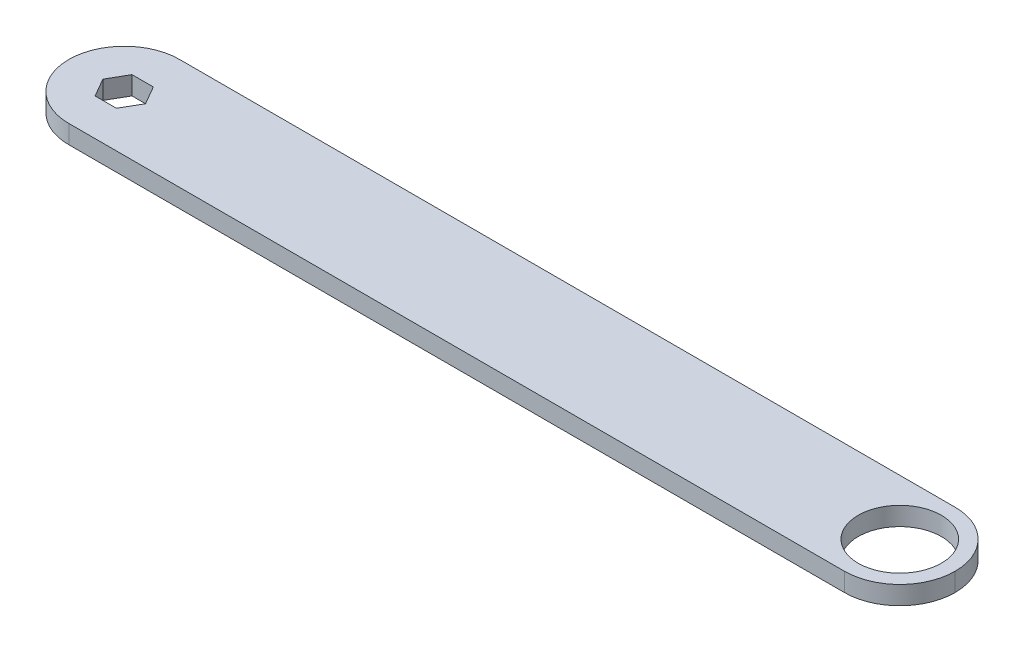
ISO-10303-21;
HEADER;
FILE_DESCRIPTION(('STEP AP214'),'2;1');
FILE_NAME('part.step','',(''),(''),'','','');
FILE_SCHEMA(('AUTOMOTIVE_DESIGN { 1 0 10303 214 1 1 1 1 }'));
ENDSEC;
DATA;
#1=APPLICATION_CONTEXT('core data for automotive mechanical design processes');
#2=APPLICATION_PROTOCOL_DEFINITION('international standard','automotive_design',2000,#1);
#3=PRODUCT_CONTEXT('',#1,'mechanical');
#4=PRODUCT('Part','Part','',(#3));
#5=PRODUCT_RELATED_PRODUCT_CATEGORY('part','',(#4));
#6=PRODUCT_DEFINITION_FORMATION('','',#4);
#7=PRODUCT_DEFINITION_CONTEXT('part definition',#1,'design');
#8=PRODUCT_DEFINITION('design','',#6,#7);
#9=PRODUCT_DEFINITION_SHAPE('','',#8);
#10=(LENGTH_UNIT() NAMED_UNIT(*) SI_UNIT(.MILLI.,.METRE.));
#11=(NAMED_UNIT(*) PLANE_ANGLE_UNIT() SI_UNIT($,.RADIAN.));
#12=(NAMED_UNIT(*) SI_UNIT($,.STERADIAN.) SOLID_ANGLE_UNIT());
#13=UNCERTAINTY_MEASURE_WITH_UNIT(LENGTH_MEASURE(1.E-05),#10,'distance_accuracy_value','');
#14=(GEOMETRIC_REPRESENTATION_CONTEXT(3) GLOBAL_UNCERTAINTY_ASSIGNED_CONTEXT((#13)) GLOBAL_UNIT_ASSIGNED_CONTEXT((#10,
#11,#12)) REPRESENTATION_CONTEXT('',''));
#15=CARTESIAN_POINT('',(0.,0.,0.));
#16=DIRECTION('',(0.,0.,1.));
#17=DIRECTION('',(1.,0.,0.));
#18=AXIS2_PLACEMENT_3D('',#15,#16,#17);
#19=CARTESIAN_POINT('',(-152.4,6.35,-19.05));
#20=DIRECTION('',(0.,0.,1.));
#21=DIRECTION('',(1.,0.,0.));
#22=AXIS2_PLACEMENT_3D('',#19,#20,#21);
#23=PLANE('',#22);
#24=DIRECTION('',(-1.,0.,0.));
#25=VECTOR('',#24,1.);
#26=CARTESIAN_POINT('',(-152.4,6.35,-19.05));
#27=LINE('',#26,#25);
#28=CARTESIAN_POINT('',(133.35,6.35,-19.05));
#29=VERTEX_POINT('',#28);
#30=CARTESIAN_POINT('',(-133.35,6.35,-19.05));
#31=VERTEX_POINT('',#30);
#32=EDGE_CURVE('E195',#29,#31,#27,.T.);
#33=ORIENTED_EDGE('',*,*,#32,.F.);
#34=DIRECTION('',(0.,-1.,0.));
#35=VECTOR('',#34,1.);
#36=CARTESIAN_POINT('',(133.35,6.35,-19.05));
#37=LINE('',#36,#35);
#38=CARTESIAN_POINT('',(133.35,0.,-19.05));
#39=VERTEX_POINT('',#38);
#40=EDGE_CURVE('E11',#29,#39,#37,.T.);
#41=ORIENTED_EDGE('',*,*,#40,.T.);
#42=DIRECTION('',(-1.,0.,0.));
#43=VECTOR('',#42,1.);
#44=CARTESIAN_POINT('',(-152.4,0.,-19.05));
#45=LINE('',#44,#43);
#46=CARTESIAN_POINT('',(-133.35,0.,-19.05));
#47=VERTEX_POINT('',#46);
#48=EDGE_CURVE('E192',#39,#47,#45,.T.);
#49=ORIENTED_EDGE('',*,*,#48,.T.);
#50=DIRECTION('',(0.,-1.,0.));
#51=VECTOR('',#50,1.);
#52=CARTESIAN_POINT('',(-133.35,6.35,-19.05));
#53=LINE('',#52,#51);
#54=EDGE_CURVE('E46',#47,#31,#53,.F.);
#55=ORIENTED_EDGE('',*,*,#54,.T.);
#56=EDGE_LOOP('',(#33,#41,#49,#55));
#57=FACE_BOUND('',#56,.T.);
#58=ADVANCED_FACE('F37',(#57),#23,.F.);
#59=CARTESIAN_POINT('',(-152.4,6.35,19.05));
#60=DIRECTION('',(0.,0.,-1.));
#61=DIRECTION('',(-1.,0.,0.));
#62=AXIS2_PLACEMENT_3D('',#59,#60,#61);
#63=PLANE('',#62);
#64=DIRECTION('',(1.,0.,0.));
#65=VECTOR('',#64,1.);
#66=CARTESIAN_POINT('',(-152.4,0.,19.05));
#67=LINE('',#66,#65);
#68=CARTESIAN_POINT('',(-133.35,0.,19.05));
#69=VERTEX_POINT('',#68);
#70=CARTESIAN_POINT('',(133.35,0.,19.05));
#71=VERTEX_POINT('',#70);
#72=EDGE_CURVE('E198',#69,#71,#67,.T.);
#73=ORIENTED_EDGE('',*,*,#72,.T.);
#74=DIRECTION('',(0.,-1.,0.));
#75=VECTOR('',#74,1.);
#76=CARTESIAN_POINT('',(133.35,6.35,19.05));
#77=LINE('',#76,#75);
#78=CARTESIAN_POINT('',(133.35,6.35,19.05));
#79=VERTEX_POINT('',#78);
#80=EDGE_CURVE('E215',#71,#79,#77,.F.);
#81=ORIENTED_EDGE('',*,*,#80,.T.);
#82=DIRECTION('',(1.,0.,0.));
#83=VECTOR('',#82,1.);
#84=CARTESIAN_POINT('',(-152.4,6.35,19.05));
#85=LINE('',#84,#83);
#86=CARTESIAN_POINT('',(-133.35,6.35,19.05));
#87=VERTEX_POINT('',#86);
#88=EDGE_CURVE('E197',#87,#79,#85,.T.);
#89=ORIENTED_EDGE('',*,*,#88,.F.);
#90=DIRECTION('',(0.,-1.,0.));
#91=VECTOR('',#90,1.);
#92=CARTESIAN_POINT('',(-133.35,6.35,19.05));
#93=LINE('',#92,#91);
#94=EDGE_CURVE('E212',#87,#69,#93,.T.);
#95=ORIENTED_EDGE('',*,*,#94,.T.);
#96=EDGE_LOOP('',(#73,#81,#89,#95));
#97=FACE_BOUND('',#96,.T.);
#98=ADVANCED_FACE('F246',(#97),#63,.F.);
#99=CARTESIAN_POINT('',(0.,6.35,0.));
#100=DIRECTION('',(0.,-1.,0.));
#101=DIRECTION('',(0.,0.,-1.));
#102=AXIS2_PLACEMENT_3D('',#99,#100,#101);
#103=PLANE('',#102);
#104=DIRECTION('',(-1.,0.,0.));
#105=VECTOR('',#104,1.);
#106=CARTESIAN_POINT('',(-129.683825790646,6.35,-6.34999999999999));
#107=LINE('',#106,#105);
#108=CARTESIAN_POINT('',(-129.683825790646,6.35,-6.34999999999999));
#109=VERTEX_POINT('',#108);
#110=CARTESIAN_POINT('',(-137.016174209354,6.35,-6.34999999999999));
#111=VERTEX_POINT('',#110);
#112=EDGE_CURVE('E168',#109,#111,#107,.T.);
#113=ORIENTED_EDGE('',*,*,#112,.F.);
#114=DIRECTION('',(-0.500000000000002,0.,-0.866025403784438));
#115=VECTOR('',#114,1.);
#116=CARTESIAN_POINT('',(-126.017651581292,6.35,0.));
#117=LINE('',#116,#115);
#118=CARTESIAN_POINT('',(-126.017651581292,6.35,0.));
#119=VERTEX_POINT('',#118);
#120=EDGE_CURVE('E135',#119,#109,#117,.T.);
#121=ORIENTED_EDGE('',*,*,#120,.F.);
#122=DIRECTION('',(0.5,0.,-0.866025403784438));
#123=VECTOR('',#122,1.);
#124=CARTESIAN_POINT('',(-129.683825790646,6.35,6.35000000000004));
#125=LINE('',#124,#123);
#126=CARTESIAN_POINT('',(-129.683825790646,6.35,6.35000000000004));
#127=VERTEX_POINT('',#126);
#128=EDGE_CURVE('E154',#127,#119,#125,.T.);
#129=ORIENTED_EDGE('',*,*,#128,.F.);
#130=DIRECTION('',(1.,0.,0.));
#131=VECTOR('',#130,1.);
#132=CARTESIAN_POINT('',(-137.016174209354,6.35,6.35000000000004));
#133=LINE('',#132,#131);
#134=CARTESIAN_POINT('',(-137.016174209354,6.35,6.35000000000004));
#135=VERTEX_POINT('',#134);
#136=EDGE_CURVE('E157',#135,#127,#133,.T.);
#137=ORIENTED_EDGE('',*,*,#136,.F.);
#138=DIRECTION('',(0.5,0.,0.866025403784439));
#139=VECTOR('',#138,1.);
#140=CARTESIAN_POINT('',(-140.682348418708,6.35,0.));
#141=LINE('',#140,#139);
#142=CARTESIAN_POINT('',(-140.682348418708,6.35,0.));
#143=VERTEX_POINT('',#142);
#144=EDGE_CURVE('E174',#143,#135,#141,.T.);
#145=ORIENTED_EDGE('',*,*,#144,.F.);
#146=DIRECTION('',(-0.499999999999999,0.,0.866025403784439));
#147=VECTOR('',#146,1.);
#148=CARTESIAN_POINT('',(-137.016174209354,6.35,-6.34999999999999));
#149=LINE('',#148,#147);
#150=EDGE_CURVE('E171',#111,#143,#149,.T.);
#151=ORIENTED_EDGE('',*,*,#150,.F.);
#152=EDGE_LOOP('',(#113,#121,#129,#137,#145,#151));
#153=FACE_BOUND('',#152,.T.);
#154=CARTESIAN_POINT('',(133.35,6.35,0.));
#155=DIRECTION('',(0.,1.,0.));
#156=DIRECTION('',(0.,0.,1.));
#157=AXIS2_PLACEMENT_3D('',#154,#155,#156);
#158=CIRCLE('',#157,14.3002);
#159=CARTESIAN_POINT('',(133.35,6.35,14.3002));
#160=VERTEX_POINT('',#159);
#161=EDGE_CURVE('E181',#160,#160,#158,.T.);
#162=ORIENTED_EDGE('',*,*,#161,.F.);
#163=EDGE_LOOP('',(#162));
#164=FACE_BOUND('',#163,.T.);
#165=ORIENTED_EDGE('',*,*,#88,.T.);
#166=CARTESIAN_POINT('',(133.35,6.35,0.));
#167=DIRECTION('',(0.,-1.,0.));
#168=DIRECTION('',(0.,0.,-1.));
#169=AXIS2_PLACEMENT_3D('',#166,#167,#168);
#170=CIRCLE('',#169,19.05);
#171=CARTESIAN_POINT('',(152.4,6.35,0.));
#172=VERTEX_POINT('',#171);
#173=EDGE_CURVE('E223',#79,#172,#170,.F.);
#174=ORIENTED_EDGE('',*,*,#173,.T.);
#175=CARTESIAN_POINT('',(133.35,6.35,0.));
#176=DIRECTION('',(0.,-1.,0.));
#177=DIRECTION('',(0.,0.,-1.));
#178=AXIS2_PLACEMENT_3D('',#175,#176,#177);
#179=CIRCLE('',#178,19.05);
#180=EDGE_CURVE('E221',#172,#29,#179,.F.);
#181=ORIENTED_EDGE('',*,*,#180,.T.);
#182=ORIENTED_EDGE('',*,*,#32,.T.);
#183=CARTESIAN_POINT('',(-133.35,6.35,0.));
#184=DIRECTION('',(0.,-1.,0.));
#185=DIRECTION('',(0.,0.,-1.));
#186=AXIS2_PLACEMENT_3D('',#183,#184,#185);
#187=CIRCLE('',#186,19.05);
#188=CARTESIAN_POINT('',(-152.4,6.35,0.));
#189=VERTEX_POINT('',#188);
#190=EDGE_CURVE('E54',#31,#189,#187,.F.);
#191=ORIENTED_EDGE('',*,*,#190,.T.);
#192=CARTESIAN_POINT('',(-133.35,6.35,0.));
#193=DIRECTION('',(0.,-1.,0.));
#194=DIRECTION('',(0.,0.,-1.));
#195=AXIS2_PLACEMENT_3D('',#192,#193,#194);
#196=CIRCLE('',#195,19.05);
#197=EDGE_CURVE('E219',#189,#87,#196,.F.);
#198=ORIENTED_EDGE('',*,*,#197,.T.);
#199=EDGE_LOOP('',(#165,#174,#181,#182,#191,#198));
#200=FACE_BOUND('',#199,.T.);
#201=ADVANCED_FACE('F249',(#153,#164,#200),#103,.F.);
#202=CARTESIAN_POINT('',(0.,0.,0.));
#203=DIRECTION('',(0.,-1.,0.));
#204=DIRECTION('',(0.,0.,-1.));
#205=AXIS2_PLACEMENT_3D('',#202,#203,#204);
#206=PLANE('',#205);
#207=DIRECTION('',(-0.500000000000002,0.,-0.866025403784438));
#208=VECTOR('',#207,1.);
#209=CARTESIAN_POINT('',(-126.017651581292,0.,0.));
#210=LINE('',#209,#208);
#211=CARTESIAN_POINT('',(-126.017651581292,0.,0.));
#212=VERTEX_POINT('',#211);
#213=CARTESIAN_POINT('',(-129.683825790646,0.,-6.34999999999999));
#214=VERTEX_POINT('',#213);
#215=EDGE_CURVE('E132',#212,#214,#210,.T.);
#216=ORIENTED_EDGE('',*,*,#215,.T.);
#217=DIRECTION('',(-1.,0.,0.));
#218=VECTOR('',#217,1.);
#219=CARTESIAN_POINT('',(-129.683825790646,0.,-6.34999999999999));
#220=LINE('',#219,#218);
#221=CARTESIAN_POINT('',(-137.016174209354,0.,-6.34999999999999));
#222=VERTEX_POINT('',#221);
#223=EDGE_CURVE('E144',#214,#222,#220,.T.);
#224=ORIENTED_EDGE('',*,*,#223,.T.);
#225=DIRECTION('',(-0.499999999999999,0.,0.866025403784439));
#226=VECTOR('',#225,1.);
#227=CARTESIAN_POINT('',(-137.016174209354,0.,-6.34999999999999));
#228=LINE('',#227,#226);
#229=CARTESIAN_POINT('',(-140.682348418708,0.,0.));
#230=VERTEX_POINT('',#229);
#231=EDGE_CURVE('E148',#222,#230,#228,.T.);
#232=ORIENTED_EDGE('',*,*,#231,.T.);
#233=DIRECTION('',(0.5,0.,0.866025403784439));
#234=VECTOR('',#233,1.);
#235=CARTESIAN_POINT('',(-140.682348418708,0.,0.));
#236=LINE('',#235,#234);
#237=CARTESIAN_POINT('',(-137.016174209354,0.,6.35000000000004));
#238=VERTEX_POINT('',#237);
#239=EDGE_CURVE('E161',#230,#238,#236,.T.);
#240=ORIENTED_EDGE('',*,*,#239,.T.);
#241=DIRECTION('',(1.,0.,0.));
#242=VECTOR('',#241,1.);
#243=CARTESIAN_POINT('',(-137.016174209354,0.,6.35000000000004));
#244=LINE('',#243,#242);
#245=CARTESIAN_POINT('',(-129.683825790646,0.,6.35000000000004));
#246=VERTEX_POINT('',#245);
#247=EDGE_CURVE('E164',#238,#246,#244,.T.);
#248=ORIENTED_EDGE('',*,*,#247,.T.);
#249=DIRECTION('',(0.5,0.,-0.866025403784438));
#250=VECTOR('',#249,1.);
#251=CARTESIAN_POINT('',(-129.683825790646,0.,6.35000000000004));
#252=LINE('',#251,#250);
#253=EDGE_CURVE('E140',#246,#212,#252,.T.);
#254=ORIENTED_EDGE('',*,*,#253,.T.);
#255=EDGE_LOOP('',(#216,#224,#232,#240,#248,#254));
#256=FACE_BOUND('',#255,.T.);
#257=CARTESIAN_POINT('',(133.35,0.,0.));
#258=DIRECTION('',(0.,1.,0.));
#259=DIRECTION('',(0.,0.,1.));
#260=AXIS2_PLACEMENT_3D('',#257,#258,#259);
#261=CIRCLE('',#260,14.3002);
#262=CARTESIAN_POINT('',(133.35,0.,14.3002));
#263=VERTEX_POINT('',#262);
#264=EDGE_CURVE('E189',#263,#263,#261,.T.);
#265=ORIENTED_EDGE('',*,*,#264,.T.);
#266=EDGE_LOOP('',(#265));
#267=FACE_BOUND('',#266,.T.);
#268=CARTESIAN_POINT('',(133.35,0.,0.));
#269=DIRECTION('',(0.,-1.,0.));
#270=DIRECTION('',(0.,0.,-1.));
#271=AXIS2_PLACEMENT_3D('',#268,#269,#270);
#272=CIRCLE('',#271,19.05);
#273=CARTESIAN_POINT('',(152.4,0.,0.));
#274=VERTEX_POINT('',#273);
#275=EDGE_CURVE('E208',#39,#274,#272,.T.);
#276=ORIENTED_EDGE('',*,*,#275,.T.);
#277=CARTESIAN_POINT('',(133.35,0.,0.));
#278=DIRECTION('',(0.,-1.,0.));
#279=DIRECTION('',(0.,0.,-1.));
#280=AXIS2_PLACEMENT_3D('',#277,#278,#279);
#281=CIRCLE('',#280,19.05);
#282=EDGE_CURVE('E210',#274,#71,#281,.T.);
#283=ORIENTED_EDGE('',*,*,#282,.T.);
#284=ORIENTED_EDGE('',*,*,#72,.F.);
#285=CARTESIAN_POINT('',(-133.35,0.,0.));
#286=DIRECTION('',(0.,-1.,0.));
#287=DIRECTION('',(0.,0.,-1.));
#288=AXIS2_PLACEMENT_3D('',#285,#286,#287);
#289=CIRCLE('',#288,19.05);
#290=CARTESIAN_POINT('',(-152.4,0.,0.));
#291=VERTEX_POINT('',#290);
#292=EDGE_CURVE('E206',#69,#291,#289,.T.);
#293=ORIENTED_EDGE('',*,*,#292,.T.);
#294=CARTESIAN_POINT('',(-133.35,0.,0.));
#295=DIRECTION('',(0.,-1.,0.));
#296=DIRECTION('',(0.,0.,-1.));
#297=AXIS2_PLACEMENT_3D('',#294,#295,#296);
#298=CIRCLE('',#297,19.05);
#299=EDGE_CURVE('E201',#291,#47,#298,.T.);
#300=ORIENTED_EDGE('',*,*,#299,.T.);
#301=ORIENTED_EDGE('',*,*,#48,.F.);
#302=EDGE_LOOP('',(#276,#283,#284,#293,#300,#301));
#303=FACE_BOUND('',#302,.T.);
#304=ADVANCED_FACE('F150',(#256,#267,#303),#206,.T.);
#305=CARTESIAN_POINT('',(133.35,0.,0.));
#306=DIRECTION('',(0.,1.,0.));
#307=DIRECTION('',(0.,0.,1.));
#308=AXIS2_PLACEMENT_3D('',#305,#306,#307);
#309=CYLINDRICAL_SURFACE('',#308,14.3002);
#310=ORIENTED_EDGE('',*,*,#264,.F.);
#311=EDGE_LOOP('',(#310));
#312=FACE_BOUND('',#311,.T.);
#313=ORIENTED_EDGE('',*,*,#161,.T.);
#314=EDGE_LOOP('',(#313));
#315=FACE_BOUND('',#314,.T.);
#316=ADVANCED_FACE('F257',(#312,#315),#309,.F.);
#317=CARTESIAN_POINT('',(-126.017651581292,0.,0.));
#318=DIRECTION('',(0.866025403784438,0.,-0.500000000000002));
#319=DIRECTION('',(-0.500000000000002,0.,-0.866025403784438));
#320=AXIS2_PLACEMENT_3D('',#317,#318,#319);
#321=PLANE('',#320);
#322=ORIENTED_EDGE('',*,*,#120,.T.);
#323=DIRECTION('',(0.,1.,0.));
#324=VECTOR('',#323,1.);
#325=CARTESIAN_POINT('',(-129.683825790646,0.,-6.34999999999999));
#326=LINE('',#325,#324);
#327=EDGE_CURVE('E128',#214,#109,#326,.T.);
#328=ORIENTED_EDGE('',*,*,#327,.F.);
#329=ORIENTED_EDGE('',*,*,#215,.F.);
#330=DIRECTION('',(0.,1.,0.));
#331=VECTOR('',#330,1.);
#332=CARTESIAN_POINT('',(-126.017651581292,0.,0.));
#333=LINE('',#332,#331);
#334=EDGE_CURVE('E179',#212,#119,#333,.T.);
#335=ORIENTED_EDGE('',*,*,#334,.T.);
#336=EDGE_LOOP('',(#322,#328,#329,#335));
#337=FACE_BOUND('',#336,.T.);
#338=ADVANCED_FACE('F130',(#337),#321,.F.);
#339=CARTESIAN_POINT('',(-129.683825790646,0.,6.35000000000004));
#340=DIRECTION('',(0.866025403784439,0.,0.5));
#341=DIRECTION('',(0.5,0.,-0.866025403784439));
#342=AXIS2_PLACEMENT_3D('',#339,#340,#341);
#343=PLANE('',#342);
#344=ORIENTED_EDGE('',*,*,#128,.T.);
#345=ORIENTED_EDGE('',*,*,#334,.F.);
#346=ORIENTED_EDGE('',*,*,#253,.F.);
#347=DIRECTION('',(0.,1.,0.));
#348=VECTOR('',#347,1.);
#349=CARTESIAN_POINT('',(-129.683825790646,0.,6.35000000000004));
#350=LINE('',#349,#348);
#351=EDGE_CURVE('E182',#246,#127,#350,.T.);
#352=ORIENTED_EDGE('',*,*,#351,.T.);
#353=EDGE_LOOP('',(#344,#345,#346,#352));
#354=FACE_BOUND('',#353,.T.);
#355=ADVANCED_FACE('F314',(#354),#343,.F.);
#356=CARTESIAN_POINT('',(-137.016174209354,0.,6.35000000000004));
#357=DIRECTION('',(0.,0.,1.));
#358=DIRECTION('',(1.,0.,0.));
#359=AXIS2_PLACEMENT_3D('',#356,#357,#358);
#360=PLANE('',#359);
#361=ORIENTED_EDGE('',*,*,#136,.T.);
#362=ORIENTED_EDGE('',*,*,#351,.F.);
#363=ORIENTED_EDGE('',*,*,#247,.F.);
#364=DIRECTION('',(0.,1.,0.));
#365=VECTOR('',#364,1.);
#366=CARTESIAN_POINT('',(-137.016174209354,0.,6.35000000000004));
#367=LINE('',#366,#365);
#368=EDGE_CURVE('E184',#238,#135,#367,.T.);
#369=ORIENTED_EDGE('',*,*,#368,.T.);
#370=EDGE_LOOP('',(#361,#362,#363,#369));
#371=FACE_BOUND('',#370,.T.);
#372=ADVANCED_FACE('F306',(#371),#360,.F.);
#373=CARTESIAN_POINT('',(-140.682348418708,0.,0.));
#374=DIRECTION('',(-0.866025403784439,0.,0.5));
#375=DIRECTION('',(0.5,0.,0.866025403784439));
#376=AXIS2_PLACEMENT_3D('',#373,#374,#375);
#377=PLANE('',#376);
#378=ORIENTED_EDGE('',*,*,#144,.T.);
#379=ORIENTED_EDGE('',*,*,#368,.F.);
#380=ORIENTED_EDGE('',*,*,#239,.F.);
#381=DIRECTION('',(0.,1.,0.));
#382=VECTOR('',#381,1.);
#383=CARTESIAN_POINT('',(-140.682348418708,0.,0.));
#384=LINE('',#383,#382);
#385=EDGE_CURVE('E186',#230,#143,#384,.T.);
#386=ORIENTED_EDGE('',*,*,#385,.T.);
#387=EDGE_LOOP('',(#378,#379,#380,#386));
#388=FACE_BOUND('',#387,.T.);
#389=ADVANCED_FACE('F298',(#388),#377,.F.);
#390=CARTESIAN_POINT('',(-137.016174209354,0.,-6.34999999999999));
#391=DIRECTION('',(-0.866025403784439,0.,-0.499999999999999));
#392=DIRECTION('',(-0.499999999999999,0.,0.866025403784439));
#393=AXIS2_PLACEMENT_3D('',#390,#391,#392);
#394=PLANE('',#393);
#395=ORIENTED_EDGE('',*,*,#150,.T.);
#396=ORIENTED_EDGE('',*,*,#385,.F.);
#397=ORIENTED_EDGE('',*,*,#231,.F.);
#398=DIRECTION('',(0.,1.,0.));
#399=VECTOR('',#398,1.);
#400=CARTESIAN_POINT('',(-137.016174209354,0.,-6.34999999999999));
#401=LINE('',#400,#399);
#402=EDGE_CURVE('E139',#222,#111,#401,.T.);
#403=ORIENTED_EDGE('',*,*,#402,.T.);
#404=EDGE_LOOP('',(#395,#396,#397,#403));
#405=FACE_BOUND('',#404,.T.);
#406=ADVANCED_FACE('F291',(#405),#394,.F.);
#407=CARTESIAN_POINT('',(-129.683825790646,0.,-6.34999999999999));
#408=DIRECTION('',(0.,0.,-1.));
#409=DIRECTION('',(-1.,0.,0.));
#410=AXIS2_PLACEMENT_3D('',#407,#408,#409);
#411=PLANE('',#410);
#412=ORIENTED_EDGE('',*,*,#112,.T.);
#413=ORIENTED_EDGE('',*,*,#402,.F.);
#414=ORIENTED_EDGE('',*,*,#223,.F.);
#415=ORIENTED_EDGE('',*,*,#327,.T.);
#416=EDGE_LOOP('',(#412,#413,#414,#415));
#417=FACE_BOUND('',#416,.T.);
#418=ADVANCED_FACE('F145',(#417),#411,.F.);
#419=CARTESIAN_POINT('',(133.35,6.35,0.));
#420=DIRECTION('',(0.,-1.,0.));
#421=DIRECTION('',(0.,0.,-1.));
#422=AXIS2_PLACEMENT_3D('',#419,#420,#421);
#423=CYLINDRICAL_SURFACE('',#422,19.05);
#424=ORIENTED_EDGE('',*,*,#40,.F.);
#425=ORIENTED_EDGE('',*,*,#180,.F.);
#426=DIRECTION('',(0.,-1.,0.));
#427=VECTOR('',#426,1.);
#428=CARTESIAN_POINT('',(152.4,6.35,0.));
#429=LINE('',#428,#427);
#430=EDGE_CURVE('E169',#274,#172,#429,.F.);
#431=ORIENTED_EDGE('',*,*,#430,.F.);
#432=ORIENTED_EDGE('',*,*,#275,.F.);
#433=EDGE_LOOP('',(#424,#425,#431,#432));
#434=FACE_BOUND('',#433,.T.);
#435=ADVANCED_FACE('F243',(#434),#423,.T.);
#436=CARTESIAN_POINT('',(133.35,6.35,0.));
#437=DIRECTION('',(0.,-1.,0.));
#438=DIRECTION('',(0.,0.,-1.));
#439=AXIS2_PLACEMENT_3D('',#436,#437,#438);
#440=CYLINDRICAL_SURFACE('',#439,19.05);
#441=ORIENTED_EDGE('',*,*,#173,.F.);
#442=ORIENTED_EDGE('',*,*,#80,.F.);
#443=ORIENTED_EDGE('',*,*,#282,.F.);
#444=ORIENTED_EDGE('',*,*,#430,.T.);
#445=EDGE_LOOP('',(#441,#442,#443,#444));
#446=FACE_BOUND('',#445,.T.);
#447=ADVANCED_FACE('F248',(#446),#440,.T.);
#448=CARTESIAN_POINT('',(-133.35,6.35,0.));
#449=DIRECTION('',(0.,-1.,0.));
#450=DIRECTION('',(0.,0.,-1.));
#451=AXIS2_PLACEMENT_3D('',#448,#449,#450);
#452=CYLINDRICAL_SURFACE('',#451,19.05);
#453=DIRECTION('',(0.,-1.,0.));
#454=VECTOR('',#453,1.);
#455=CARTESIAN_POINT('',(-152.4,6.35,0.));
#456=LINE('',#455,#454);
#457=EDGE_CURVE('E41',#189,#291,#456,.T.);
#458=ORIENTED_EDGE('',*,*,#457,.F.);
#459=ORIENTED_EDGE('',*,*,#190,.F.);
#460=ORIENTED_EDGE('',*,*,#54,.F.);
#461=ORIENTED_EDGE('',*,*,#299,.F.);
#462=EDGE_LOOP('',(#458,#459,#460,#461));
#463=FACE_BOUND('',#462,.T.);
#464=ADVANCED_FACE('F39',(#463),#452,.T.);
#465=CARTESIAN_POINT('',(-133.35,6.35,0.));
#466=DIRECTION('',(0.,-1.,0.));
#467=DIRECTION('',(0.,0.,-1.));
#468=AXIS2_PLACEMENT_3D('',#465,#466,#467);
#469=CYLINDRICAL_SURFACE('',#468,19.05);
#470=ORIENTED_EDGE('',*,*,#197,.F.);
#471=ORIENTED_EDGE('',*,*,#457,.T.);
#472=ORIENTED_EDGE('',*,*,#292,.F.);
#473=ORIENTED_EDGE('',*,*,#94,.F.);
#474=EDGE_LOOP('',(#470,#471,#472,#473));
#475=FACE_BOUND('',#474,.T.);
#476=ADVANCED_FACE('F232',(#475),#469,.T.);
#477=CLOSED_SHELL('',(#58,#98,#201,#304,#316,#338,#355,#372,#389,#406,#418,#435,#447,#464,#476));
#478=MANIFOLD_SOLID_BREP('B2',#477);
#479=ADVANCED_BREP_SHAPE_REPRESENTATION('',(#18,#478),#14);
#480=SHAPE_DEFINITION_REPRESENTATION(#9,#479);
ENDSEC;
END-ISO-10303-21;
